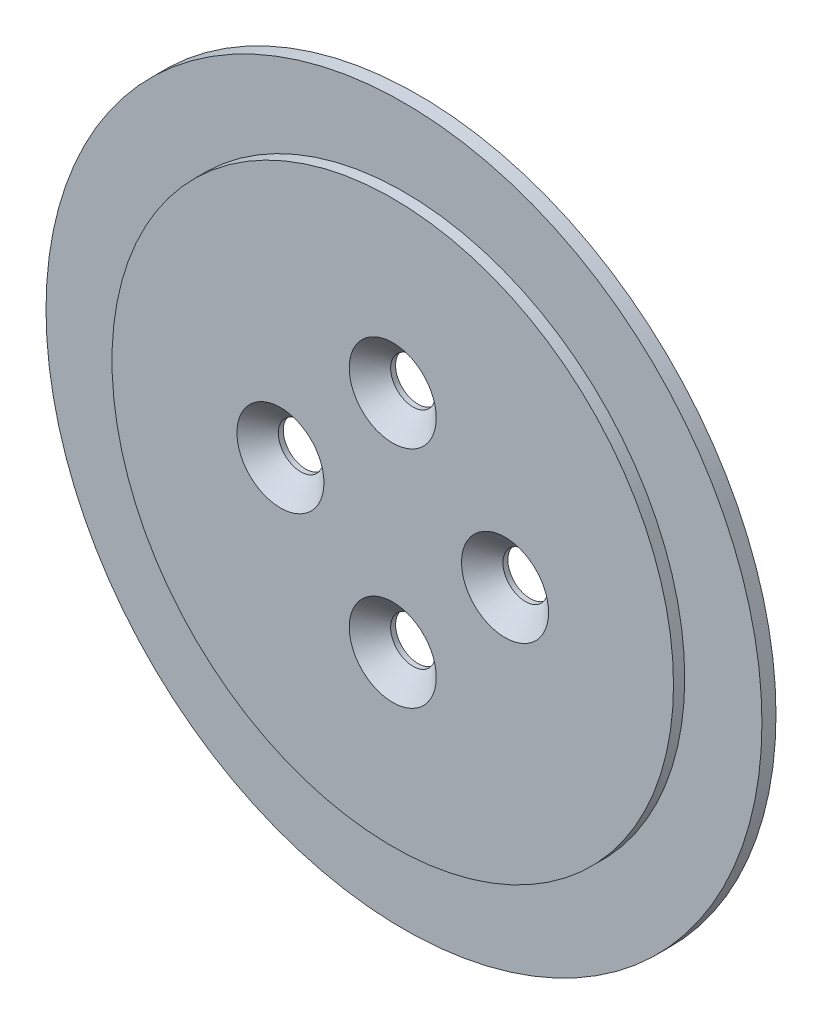
ISO-10303-21;
HEADER;
FILE_DESCRIPTION(('STEP AP214'),'2;1');
FILE_NAME('part.step','',(''),(''),'','','');
FILE_SCHEMA(('AUTOMOTIVE_DESIGN { 1 0 10303 214 1 1 1 1 }'));
ENDSEC;
DATA;
#1=APPLICATION_CONTEXT('core data for automotive mechanical design processes');
#2=APPLICATION_PROTOCOL_DEFINITION('international standard','automotive_design',2000,#1);
#3=PRODUCT_CONTEXT('',#1,'mechanical');
#4=PRODUCT('Part','Part','',(#3));
#5=PRODUCT_RELATED_PRODUCT_CATEGORY('part','',(#4));
#6=PRODUCT_DEFINITION_FORMATION('','',#4);
#7=PRODUCT_DEFINITION_CONTEXT('part definition',#1,'design');
#8=PRODUCT_DEFINITION('design','',#6,#7);
#9=PRODUCT_DEFINITION_SHAPE('','',#8);
#10=(LENGTH_UNIT() NAMED_UNIT(*) SI_UNIT(.MILLI.,.METRE.));
#11=(NAMED_UNIT(*) PLANE_ANGLE_UNIT() SI_UNIT($,.RADIAN.));
#12=(NAMED_UNIT(*) SI_UNIT($,.STERADIAN.) SOLID_ANGLE_UNIT());
#13=UNCERTAINTY_MEASURE_WITH_UNIT(LENGTH_MEASURE(1.E-05),#10,'distance_accuracy_value','');
#14=(GEOMETRIC_REPRESENTATION_CONTEXT(3) GLOBAL_UNCERTAINTY_ASSIGNED_CONTEXT((#13)) GLOBAL_UNIT_ASSIGNED_CONTEXT((#10,
#11,#12)) REPRESENTATION_CONTEXT('',''));
#15=CARTESIAN_POINT('',(0.,0.,0.));
#16=DIRECTION('',(0.,0.,1.));
#17=DIRECTION('',(1.,0.,0.));
#18=AXIS2_PLACEMENT_3D('',#15,#16,#17);
#19=CARTESIAN_POINT('',(0.,0.,1.));
#20=DIRECTION('',(0.,0.,-1.));
#21=DIRECTION('',(-1.,0.,0.));
#22=AXIS2_PLACEMENT_3D('',#19,#20,#21);
#23=CYLINDRICAL_SURFACE('',#22,25.5);
#24=CARTESIAN_POINT('',(0.,0.,1.));
#25=DIRECTION('',(0.,0.,1.));
#26=DIRECTION('',(1.,0.,0.));
#27=AXIS2_PLACEMENT_3D('',#24,#25,#26);
#28=CIRCLE('',#27,25.5);
#29=CARTESIAN_POINT('',(25.5,0.,1.));
#30=VERTEX_POINT('',#29);
#31=EDGE_CURVE('E10',#30,#30,#28,.T.);
#32=ORIENTED_EDGE('',*,*,#31,.F.);
#33=EDGE_LOOP('',(#32));
#34=FACE_BOUND('',#33,.T.);
#35=CARTESIAN_POINT('',(0.,0.,0.));
#36=DIRECTION('',(0.,0.,1.));
#37=DIRECTION('',(1.,0.,0.));
#38=AXIS2_PLACEMENT_3D('',#35,#36,#37);
#39=CIRCLE('',#38,25.5);
#40=CARTESIAN_POINT('',(25.5,0.,0.));
#41=VERTEX_POINT('',#40);
#42=EDGE_CURVE('E40',#41,#41,#39,.T.);
#43=ORIENTED_EDGE('',*,*,#42,.T.);
#44=EDGE_LOOP('',(#43));
#45=FACE_BOUND('',#44,.T.);
#46=ADVANCED_FACE('F37',(#34,#45),#23,.T.);
#47=CARTESIAN_POINT('',(0.,0.,1.));
#48=DIRECTION('',(0.,0.,1.));
#49=DIRECTION('',(1.,0.,0.));
#50=AXIS2_PLACEMENT_3D('',#47,#48,#49);
#51=PLANE('',#50);
#52=CARTESIAN_POINT('',(0.,0.,1.));
#53=DIRECTION('',(0.,0.,1.));
#54=DIRECTION('',(1.,0.,0.));
#55=AXIS2_PLACEMENT_3D('',#52,#53,#54);
#56=CIRCLE('',#55,20.);
#57=CARTESIAN_POINT('',(20.,0.,1.));
#58=VERTEX_POINT('',#57);
#59=EDGE_CURVE('E45',#58,#58,#56,.T.);
#60=ORIENTED_EDGE('',*,*,#59,.F.);
#61=EDGE_LOOP('',(#60));
#62=FACE_BOUND('',#61,.T.);
#63=ORIENTED_EDGE('',*,*,#31,.T.);
#64=EDGE_LOOP('',(#63));
#65=FACE_BOUND('',#64,.T.);
#66=ADVANCED_FACE('F128',(#62,#65),#51,.T.);
#67=CARTESIAN_POINT('',(0.,0.,0.));
#68=DIRECTION('',(0.,0.,1.));
#69=DIRECTION('',(1.,0.,0.));
#70=AXIS2_PLACEMENT_3D('',#67,#68,#69);
#71=PLANE('',#70);
#72=CARTESIAN_POINT('',(-7.99999999999977,-2.26883816723573E-13,0.));
#73=DIRECTION('',(0.,0.,1.));
#74=DIRECTION('',(1.,0.,0.));
#75=AXIS2_PLACEMENT_3D('',#72,#73,#74);
#76=CIRCLE('',#75,1.6);
#77=CARTESIAN_POINT('',(-6.39999999999977,-2.26883816723573E-13,0.));
#78=VERTEX_POINT('',#77);
#79=EDGE_CURVE('E92',#78,#78,#76,.T.);
#80=ORIENTED_EDGE('',*,*,#79,.T.);
#81=EDGE_LOOP('',(#80));
#82=FACE_BOUND('',#81,.T.);
#83=CARTESIAN_POINT('',(0.,8.,0.));
#84=DIRECTION('',(0.,0.,1.));
#85=DIRECTION('',(1.,0.,0.));
#86=AXIS2_PLACEMENT_3D('',#83,#84,#85);
#87=CIRCLE('',#86,1.6);
#88=CARTESIAN_POINT('',(1.6,8.,0.));
#89=VERTEX_POINT('',#88);
#90=EDGE_CURVE('E80',#89,#89,#87,.T.);
#91=ORIENTED_EDGE('',*,*,#90,.T.);
#92=EDGE_LOOP('',(#91));
#93=FACE_BOUND('',#92,.T.);
#94=CARTESIAN_POINT('',(8.00000000000023,2.25904099284255E-13,0.));
#95=DIRECTION('',(0.,0.,1.));
#96=DIRECTION('',(1.,0.,0.));
#97=AXIS2_PLACEMENT_3D('',#94,#95,#96);
#98=CIRCLE('',#97,1.6);
#99=CARTESIAN_POINT('',(9.60000000000023,2.25904099284255E-13,0.));
#100=VERTEX_POINT('',#99);
#101=EDGE_CURVE('E68',#100,#100,#98,.T.);
#102=ORIENTED_EDGE('',*,*,#101,.T.);
#103=EDGE_LOOP('',(#102));
#104=FACE_BOUND('',#103,.T.);
#105=CARTESIAN_POINT('',(4.51808198568511E-13,-8.,0.));
#106=DIRECTION('',(0.,0.,1.));
#107=DIRECTION('',(1.,0.,0.));
#108=AXIS2_PLACEMENT_3D('',#105,#106,#107);
#109=CIRCLE('',#108,1.6);
#110=CARTESIAN_POINT('',(1.60000000000045,-8.,0.));
#111=VERTEX_POINT('',#110);
#112=EDGE_CURVE('E56',#111,#111,#109,.T.);
#113=ORIENTED_EDGE('',*,*,#112,.T.);
#114=EDGE_LOOP('',(#113));
#115=FACE_BOUND('',#114,.T.);
#116=ORIENTED_EDGE('',*,*,#42,.F.);
#117=EDGE_LOOP('',(#116));
#118=FACE_BOUND('',#117,.T.);
#119=ADVANCED_FACE('F122',(#82,#93,#104,#115,#118),#71,.F.);
#120=CARTESIAN_POINT('',(0.,0.,1.8));
#121=DIRECTION('',(0.,0.,-1.));
#122=DIRECTION('',(-1.,0.,0.));
#123=AXIS2_PLACEMENT_3D('',#120,#121,#122);
#124=CYLINDRICAL_SURFACE('',#123,20.);
#125=ORIENTED_EDGE('',*,*,#59,.T.);
#126=EDGE_LOOP('',(#125));
#127=FACE_BOUND('',#126,.T.);
#128=CARTESIAN_POINT('',(0.,0.,1.8));
#129=DIRECTION('',(0.,0.,1.));
#130=DIRECTION('',(1.,0.,0.));
#131=AXIS2_PLACEMENT_3D('',#128,#129,#130);
#132=CIRCLE('',#131,20.);
#133=CARTESIAN_POINT('',(20.,0.,1.8));
#134=VERTEX_POINT('',#133);
#135=EDGE_CURVE('E52',#134,#134,#132,.T.);
#136=ORIENTED_EDGE('',*,*,#135,.F.);
#137=EDGE_LOOP('',(#136));
#138=FACE_BOUND('',#137,.T.);
#139=ADVANCED_FACE('F111',(#127,#138),#124,.T.);
#140=CARTESIAN_POINT('',(0.,0.,1.8));
#141=DIRECTION('',(0.,0.,1.));
#142=DIRECTION('',(1.,0.,0.));
#143=AXIS2_PLACEMENT_3D('',#140,#141,#142);
#144=PLANE('',#143);
#145=CARTESIAN_POINT('',(-7.99999999999977,-2.26883816723573E-13,1.8));
#146=DIRECTION('',(0.,0.,1.));
#147=DIRECTION('',(1.,0.,0.));
#148=AXIS2_PLACEMENT_3D('',#145,#146,#147);
#149=CIRCLE('',#148,3.1);
#150=CARTESIAN_POINT('',(-4.89999999999977,-2.26883816723573E-13,1.8));
#151=VERTEX_POINT('',#150);
#152=EDGE_CURVE('E100',#151,#151,#149,.T.);
#153=ORIENTED_EDGE('',*,*,#152,.F.);
#154=EDGE_LOOP('',(#153));
#155=FACE_BOUND('',#154,.T.);
#156=CARTESIAN_POINT('',(0.,8.,1.8));
#157=DIRECTION('',(0.,0.,1.));
#158=DIRECTION('',(1.,0.,0.));
#159=AXIS2_PLACEMENT_3D('',#156,#157,#158);
#160=CIRCLE('',#159,3.1);
#161=CARTESIAN_POINT('',(3.1,8.,1.8));
#162=VERTEX_POINT('',#161);
#163=EDGE_CURVE('E88',#162,#162,#160,.T.);
#164=ORIENTED_EDGE('',*,*,#163,.F.);
#165=EDGE_LOOP('',(#164));
#166=FACE_BOUND('',#165,.T.);
#167=CARTESIAN_POINT('',(8.00000000000023,2.25904099284255E-13,1.8));
#168=DIRECTION('',(0.,0.,1.));
#169=DIRECTION('',(1.,0.,0.));
#170=AXIS2_PLACEMENT_3D('',#167,#168,#169);
#171=CIRCLE('',#170,3.1);
#172=CARTESIAN_POINT('',(11.1000000000002,2.25904099284255E-13,1.8));
#173=VERTEX_POINT('',#172);
#174=EDGE_CURVE('E76',#173,#173,#171,.T.);
#175=ORIENTED_EDGE('',*,*,#174,.F.);
#176=EDGE_LOOP('',(#175));
#177=FACE_BOUND('',#176,.T.);
#178=CARTESIAN_POINT('',(4.51808198568511E-13,-8.,1.8));
#179=DIRECTION('',(0.,0.,1.));
#180=DIRECTION('',(1.,0.,0.));
#181=AXIS2_PLACEMENT_3D('',#178,#179,#180);
#182=CIRCLE('',#181,3.1);
#183=CARTESIAN_POINT('',(3.10000000000045,-8.,1.8));
#184=VERTEX_POINT('',#183);
#185=EDGE_CURVE('E64',#184,#184,#182,.T.);
#186=ORIENTED_EDGE('',*,*,#185,.F.);
#187=EDGE_LOOP('',(#186));
#188=FACE_BOUND('',#187,.T.);
#189=ORIENTED_EDGE('',*,*,#135,.T.);
#190=EDGE_LOOP('',(#189));
#191=FACE_BOUND('',#190,.T.);
#192=ADVANCED_FACE('F107',(#155,#166,#177,#188,#191),#144,.T.);
#193=CARTESIAN_POINT('',(4.51808198568511E-13,-8.,1.8));
#194=DIRECTION('',(0.,0.,1.));
#195=DIRECTION('',(1.,0.,0.));
#196=AXIS2_PLACEMENT_3D('',#193,#194,#195);
#197=CYLINDRICAL_SURFACE('',#196,1.6);
#198=ORIENTED_EDGE('',*,*,#112,.F.);
#199=EDGE_LOOP('',(#198));
#200=FACE_BOUND('',#199,.T.);
#201=CARTESIAN_POINT('',(4.51808198568511E-13,-8.,0.351466837789394));
#202=DIRECTION('',(0.,0.,1.));
#203=DIRECTION('',(1.,0.,0.));
#204=AXIS2_PLACEMENT_3D('',#201,#202,#203);
#205=CIRCLE('',#204,1.6);
#206=CARTESIAN_POINT('',(1.60000000000045,-8.,0.351466837789394));
#207=VERTEX_POINT('',#206);
#208=EDGE_CURVE('E60',#207,#207,#205,.T.);
#209=ORIENTED_EDGE('',*,*,#208,.T.);
#210=EDGE_LOOP('',(#209));
#211=FACE_BOUND('',#210,.T.);
#212=ADVANCED_FACE('F110',(#200,#211),#197,.F.);
#213=CARTESIAN_POINT('',(4.51808198568511E-13,-8.,1.8));
#214=DIRECTION('',(0.,0.,1.));
#215=DIRECTION('',(1.,0.,0.));
#216=AXIS2_PLACEMENT_3D('',#213,#214,#215);
#217=CONICAL_SURFACE('',#216,3.1,0.802851455917393);
#218=ORIENTED_EDGE('',*,*,#208,.F.);
#219=EDGE_LOOP('',(#218));
#220=FACE_BOUND('',#219,.T.);
#221=ORIENTED_EDGE('',*,*,#185,.T.);
#222=EDGE_LOOP('',(#221));
#223=FACE_BOUND('',#222,.T.);
#224=ADVANCED_FACE('F167',(#220,#223),#217,.F.);
#225=CARTESIAN_POINT('',(8.00000000000023,2.25904099284255E-13,1.8));
#226=DIRECTION('',(0.,0.,1.));
#227=DIRECTION('',(1.,0.,0.));
#228=AXIS2_PLACEMENT_3D('',#225,#226,#227);
#229=CYLINDRICAL_SURFACE('',#228,1.6);
#230=ORIENTED_EDGE('',*,*,#101,.F.);
#231=EDGE_LOOP('',(#230));
#232=FACE_BOUND('',#231,.T.);
#233=CARTESIAN_POINT('',(8.00000000000023,2.25904099284255E-13,0.351466837789394));
#234=DIRECTION('',(0.,0.,1.));
#235=DIRECTION('',(1.,0.,0.));
#236=AXIS2_PLACEMENT_3D('',#233,#234,#235);
#237=CIRCLE('',#236,1.6);
#238=CARTESIAN_POINT('',(9.60000000000023,2.25904099284255E-13,0.351466837789394));
#239=VERTEX_POINT('',#238);
#240=EDGE_CURVE('E72',#239,#239,#237,.T.);
#241=ORIENTED_EDGE('',*,*,#240,.T.);
#242=EDGE_LOOP('',(#241));
#243=FACE_BOUND('',#242,.T.);
#244=ADVANCED_FACE('F177',(#232,#243),#229,.F.);
#245=CARTESIAN_POINT('',(8.00000000000023,2.25904099284255E-13,1.8));
#246=DIRECTION('',(0.,0.,1.));
#247=DIRECTION('',(1.,0.,0.));
#248=AXIS2_PLACEMENT_3D('',#245,#246,#247);
#249=CONICAL_SURFACE('',#248,3.1,0.802851455917393);
#250=ORIENTED_EDGE('',*,*,#240,.F.);
#251=EDGE_LOOP('',(#250));
#252=FACE_BOUND('',#251,.T.);
#253=ORIENTED_EDGE('',*,*,#174,.T.);
#254=EDGE_LOOP('',(#253));
#255=FACE_BOUND('',#254,.T.);
#256=ADVANCED_FACE('F187',(#252,#255),#249,.F.);
#257=CARTESIAN_POINT('',(0.,8.,1.8));
#258=DIRECTION('',(0.,0.,1.));
#259=DIRECTION('',(1.,0.,0.));
#260=AXIS2_PLACEMENT_3D('',#257,#258,#259);
#261=CYLINDRICAL_SURFACE('',#260,1.6);
#262=ORIENTED_EDGE('',*,*,#90,.F.);
#263=EDGE_LOOP('',(#262));
#264=FACE_BOUND('',#263,.T.);
#265=CARTESIAN_POINT('',(0.,8.,0.351466837789394));
#266=DIRECTION('',(0.,0.,1.));
#267=DIRECTION('',(1.,0.,0.));
#268=AXIS2_PLACEMENT_3D('',#265,#266,#267);
#269=CIRCLE('',#268,1.6);
#270=CARTESIAN_POINT('',(1.6,8.,0.351466837789394));
#271=VERTEX_POINT('',#270);
#272=EDGE_CURVE('E84',#271,#271,#269,.T.);
#273=ORIENTED_EDGE('',*,*,#272,.T.);
#274=EDGE_LOOP('',(#273));
#275=FACE_BOUND('',#274,.T.);
#276=ADVANCED_FACE('F197',(#264,#275),#261,.F.);
#277=CARTESIAN_POINT('',(0.,8.,1.8));
#278=DIRECTION('',(0.,0.,1.));
#279=DIRECTION('',(1.,0.,0.));
#280=AXIS2_PLACEMENT_3D('',#277,#278,#279);
#281=CONICAL_SURFACE('',#280,3.1,0.802851455917393);
#282=ORIENTED_EDGE('',*,*,#272,.F.);
#283=EDGE_LOOP('',(#282));
#284=FACE_BOUND('',#283,.T.);
#285=ORIENTED_EDGE('',*,*,#163,.T.);
#286=EDGE_LOOP('',(#285));
#287=FACE_BOUND('',#286,.T.);
#288=ADVANCED_FACE('F207',(#284,#287),#281,.F.);
#289=CARTESIAN_POINT('',(-7.99999999999977,-2.26883816723573E-13,1.8));
#290=DIRECTION('',(0.,0.,1.));
#291=DIRECTION('',(1.,0.,0.));
#292=AXIS2_PLACEMENT_3D('',#289,#290,#291);
#293=CYLINDRICAL_SURFACE('',#292,1.6);
#294=ORIENTED_EDGE('',*,*,#79,.F.);
#295=EDGE_LOOP('',(#294));
#296=FACE_BOUND('',#295,.T.);
#297=CARTESIAN_POINT('',(-7.99999999999977,-2.26883816723573E-13,0.351466837789394));
#298=DIRECTION('',(0.,0.,1.));
#299=DIRECTION('',(1.,0.,0.));
#300=AXIS2_PLACEMENT_3D('',#297,#298,#299);
#301=CIRCLE('',#300,1.6);
#302=CARTESIAN_POINT('',(-6.39999999999977,-2.26883816723573E-13,0.351466837789394));
#303=VERTEX_POINT('',#302);
#304=EDGE_CURVE('E96',#303,#303,#301,.T.);
#305=ORIENTED_EDGE('',*,*,#304,.T.);
#306=EDGE_LOOP('',(#305));
#307=FACE_BOUND('',#306,.T.);
#308=ADVANCED_FACE('F217',(#296,#307),#293,.F.);
#309=CARTESIAN_POINT('',(-7.99999999999977,-2.26883816723573E-13,1.8));
#310=DIRECTION('',(0.,0.,1.));
#311=DIRECTION('',(1.,0.,0.));
#312=AXIS2_PLACEMENT_3D('',#309,#310,#311);
#313=CONICAL_SURFACE('',#312,3.1,0.802851455917393);
#314=ORIENTED_EDGE('',*,*,#304,.F.);
#315=EDGE_LOOP('',(#314));
#316=FACE_BOUND('',#315,.T.);
#317=ORIENTED_EDGE('',*,*,#152,.T.);
#318=EDGE_LOOP('',(#317));
#319=FACE_BOUND('',#318,.T.);
#320=ADVANCED_FACE('F105',(#316,#319),#313,.F.);
#321=CLOSED_SHELL('',(#46,#66,#119,#139,#192,#212,#224,#244,#256,#276,#288,#308,#320));
#322=MANIFOLD_SOLID_BREP('B2',#321);
#323=ADVANCED_BREP_SHAPE_REPRESENTATION('',(#18,#322),#14);
#324=SHAPE_DEFINITION_REPRESENTATION(#9,#323);
ENDSEC;
END-ISO-10303-21;
